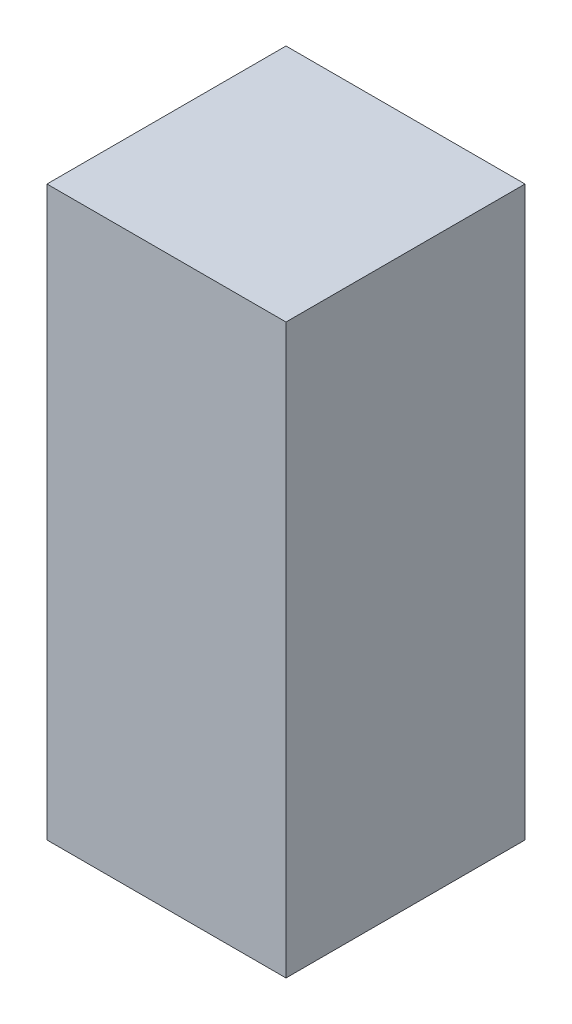
ISO-10303-21;
HEADER;
FILE_DESCRIPTION(('STEP AP214'),'2;1');
FILE_NAME('part.step','',(''),(''),'','','');
FILE_SCHEMA(('AUTOMOTIVE_DESIGN { 1 0 10303 214 1 1 1 1 }'));
ENDSEC;
DATA;
#1=APPLICATION_CONTEXT('core data for automotive mechanical design processes');
#2=APPLICATION_PROTOCOL_DEFINITION('international standard','automotive_design',2000,#1);
#3=PRODUCT_CONTEXT('',#1,'mechanical');
#4=PRODUCT('Part','Part','',(#3));
#5=PRODUCT_RELATED_PRODUCT_CATEGORY('part','',(#4));
#6=PRODUCT_DEFINITION_FORMATION('','',#4);
#7=PRODUCT_DEFINITION_CONTEXT('part definition',#1,'design');
#8=PRODUCT_DEFINITION('design','',#6,#7);
#9=PRODUCT_DEFINITION_SHAPE('','',#8);
#10=(LENGTH_UNIT() NAMED_UNIT(*) SI_UNIT(.MILLI.,.METRE.));
#11=(NAMED_UNIT(*) PLANE_ANGLE_UNIT() SI_UNIT($,.RADIAN.));
#12=(NAMED_UNIT(*) SI_UNIT($,.STERADIAN.) SOLID_ANGLE_UNIT());
#13=UNCERTAINTY_MEASURE_WITH_UNIT(LENGTH_MEASURE(1.E-05),#10,'distance_accuracy_value','');
#14=(GEOMETRIC_REPRESENTATION_CONTEXT(3) GLOBAL_UNCERTAINTY_ASSIGNED_CONTEXT((#13)) GLOBAL_UNIT_ASSIGNED_CONTEXT((#10,
#11,#12)) REPRESENTATION_CONTEXT('',''));
#15=CARTESIAN_POINT('',(0.,0.,0.));
#16=DIRECTION('',(0.,0.,1.));
#17=DIRECTION('',(1.,0.,0.));
#18=AXIS2_PLACEMENT_3D('',#15,#16,#17);
#19=CARTESIAN_POINT('',(3.,14.26,3.));
#20=DIRECTION('',(-1.,0.,0.));
#21=DIRECTION('',(0.,0.,1.));
#22=AXIS2_PLACEMENT_3D('',#19,#20,#21);
#23=PLANE('',#22);
#24=DIRECTION('',(0.,0.,-1.));
#25=VECTOR('',#24,1.);
#26=CARTESIAN_POINT('',(3.,0.,3.));
#27=LINE('',#26,#25);
#28=CARTESIAN_POINT('',(3.,0.,3.));
#29=VERTEX_POINT('',#28);
#30=CARTESIAN_POINT('',(3.,0.,-3.));
#31=VERTEX_POINT('',#30);
#32=EDGE_CURVE('E97',#29,#31,#27,.T.);
#33=ORIENTED_EDGE('',*,*,#32,.T.);
#34=DIRECTION('',(0.,-1.,0.));
#35=VECTOR('',#34,1.);
#36=CARTESIAN_POINT('',(3.,14.26,-3.));
#37=LINE('',#36,#35);
#38=CARTESIAN_POINT('',(3.,14.26,-3.));
#39=VERTEX_POINT('',#38);
#40=EDGE_CURVE('E11',#39,#31,#37,.T.);
#41=ORIENTED_EDGE('',*,*,#40,.F.);
#42=DIRECTION('',(0.,0.,-1.));
#43=VECTOR('',#42,1.);
#44=CARTESIAN_POINT('',(3.,14.26,3.));
#45=LINE('',#44,#43);
#46=CARTESIAN_POINT('',(3.,14.26,3.));
#47=VERTEX_POINT('',#46);
#48=EDGE_CURVE('E85',#47,#39,#45,.T.);
#49=ORIENTED_EDGE('',*,*,#48,.F.);
#50=DIRECTION('',(0.,-1.,0.));
#51=VECTOR('',#50,1.);
#52=CARTESIAN_POINT('',(3.,14.26,3.));
#53=LINE('',#52,#51);
#54=EDGE_CURVE('E93',#47,#29,#53,.T.);
#55=ORIENTED_EDGE('',*,*,#54,.T.);
#56=EDGE_LOOP('',(#33,#41,#49,#55));
#57=FACE_BOUND('',#56,.T.);
#58=ADVANCED_FACE('F34',(#57),#23,.F.);
#59=CARTESIAN_POINT('',(-3.,14.26,-3.));
#60=DIRECTION('',(0.,0.,1.));
#61=DIRECTION('',(1.,0.,0.));
#62=AXIS2_PLACEMENT_3D('',#59,#60,#61);
#63=PLANE('',#62);
#64=DIRECTION('',(-1.,0.,0.));
#65=VECTOR('',#64,1.);
#66=CARTESIAN_POINT('',(-3.,0.,-3.));
#67=LINE('',#66,#65);
#68=CARTESIAN_POINT('',(-3.,0.,-3.));
#69=VERTEX_POINT('',#68);
#70=EDGE_CURVE('E89',#31,#69,#67,.T.);
#71=ORIENTED_EDGE('',*,*,#70,.T.);
#72=DIRECTION('',(0.,-1.,0.));
#73=VECTOR('',#72,1.);
#74=CARTESIAN_POINT('',(-3.,14.26,-3.));
#75=LINE('',#74,#73);
#76=CARTESIAN_POINT('',(-3.,14.26,-3.));
#77=VERTEX_POINT('',#76);
#78=EDGE_CURVE('E42',#77,#69,#75,.T.);
#79=ORIENTED_EDGE('',*,*,#78,.F.);
#80=DIRECTION('',(-1.,0.,0.));
#81=VECTOR('',#80,1.);
#82=CARTESIAN_POINT('',(-3.,14.26,-3.));
#83=LINE('',#82,#81);
#84=EDGE_CURVE('E80',#39,#77,#83,.T.);
#85=ORIENTED_EDGE('',*,*,#84,.F.);
#86=ORIENTED_EDGE('',*,*,#40,.T.);
#87=EDGE_LOOP('',(#71,#79,#85,#86));
#88=FACE_BOUND('',#87,.T.);
#89=ADVANCED_FACE('F88',(#88),#63,.F.);
#90=CARTESIAN_POINT('',(-3.,14.26,3.));
#91=DIRECTION('',(1.,0.,0.));
#92=DIRECTION('',(0.,0.,-1.));
#93=AXIS2_PLACEMENT_3D('',#90,#91,#92);
#94=PLANE('',#93);
#95=DIRECTION('',(0.,0.,1.));
#96=VECTOR('',#95,1.);
#97=CARTESIAN_POINT('',(-3.,0.,3.));
#98=LINE('',#97,#96);
#99=CARTESIAN_POINT('',(-3.,0.,3.));
#100=VERTEX_POINT('',#99);
#101=EDGE_CURVE('E67',#69,#100,#98,.T.);
#102=ORIENTED_EDGE('',*,*,#101,.T.);
#103=DIRECTION('',(0.,-1.,0.));
#104=VECTOR('',#103,1.);
#105=CARTESIAN_POINT('',(-3.,14.26,3.));
#106=LINE('',#105,#104);
#107=CARTESIAN_POINT('',(-3.,14.26,3.));
#108=VERTEX_POINT('',#107);
#109=EDGE_CURVE('E90',#108,#100,#106,.T.);
#110=ORIENTED_EDGE('',*,*,#109,.F.);
#111=DIRECTION('',(0.,0.,1.));
#112=VECTOR('',#111,1.);
#113=CARTESIAN_POINT('',(-3.,14.26,3.));
#114=LINE('',#113,#112);
#115=EDGE_CURVE('E83',#77,#108,#114,.T.);
#116=ORIENTED_EDGE('',*,*,#115,.F.);
#117=ORIENTED_EDGE('',*,*,#78,.T.);
#118=EDGE_LOOP('',(#102,#110,#116,#117));
#119=FACE_BOUND('',#118,.T.);
#120=ADVANCED_FACE('F91',(#119),#94,.F.);
#121=CARTESIAN_POINT('',(-3.,14.26,3.));
#122=DIRECTION('',(0.,0.,-1.));
#123=DIRECTION('',(-1.,0.,0.));
#124=AXIS2_PLACEMENT_3D('',#121,#122,#123);
#125=PLANE('',#124);
#126=DIRECTION('',(1.,0.,0.));
#127=VECTOR('',#126,1.);
#128=CARTESIAN_POINT('',(-3.,0.,3.));
#129=LINE('',#128,#127);
#130=EDGE_CURVE('E73',#100,#29,#129,.T.);
#131=ORIENTED_EDGE('',*,*,#130,.T.);
#132=ORIENTED_EDGE('',*,*,#54,.F.);
#133=DIRECTION('',(1.,0.,0.));
#134=VECTOR('',#133,1.);
#135=CARTESIAN_POINT('',(-3.,14.26,3.));
#136=LINE('',#135,#134);
#137=EDGE_CURVE('E50',#108,#47,#136,.T.);
#138=ORIENTED_EDGE('',*,*,#137,.F.);
#139=ORIENTED_EDGE('',*,*,#109,.T.);
#140=EDGE_LOOP('',(#131,#132,#138,#139));
#141=FACE_BOUND('',#140,.T.);
#142=ADVANCED_FACE('F104',(#141),#125,.F.);
#143=CARTESIAN_POINT('',(0.,14.26,0.));
#144=DIRECTION('',(0.,-1.,0.));
#145=DIRECTION('',(0.,0.,-1.));
#146=AXIS2_PLACEMENT_3D('',#143,#144,#145);
#147=PLANE('',#146);
#148=ORIENTED_EDGE('',*,*,#48,.T.);
#149=ORIENTED_EDGE('',*,*,#84,.T.);
#150=ORIENTED_EDGE('',*,*,#115,.T.);
#151=ORIENTED_EDGE('',*,*,#137,.T.);
#152=EDGE_LOOP('',(#148,#149,#150,#151));
#153=FACE_BOUND('',#152,.T.);
#154=ADVANCED_FACE('F81',(#153),#147,.F.);
#155=CARTESIAN_POINT('',(0.,0.,0.));
#156=DIRECTION('',(0.,-1.,0.));
#157=DIRECTION('',(0.,0.,-1.));
#158=AXIS2_PLACEMENT_3D('',#155,#156,#157);
#159=PLANE('',#158);
#160=ORIENTED_EDGE('',*,*,#32,.F.);
#161=ORIENTED_EDGE('',*,*,#130,.F.);
#162=ORIENTED_EDGE('',*,*,#101,.F.);
#163=ORIENTED_EDGE('',*,*,#70,.F.);
#164=EDGE_LOOP('',(#160,#161,#162,#163));
#165=FACE_BOUND('',#164,.T.);
#166=ADVANCED_FACE('F107',(#165),#159,.T.);
#167=CLOSED_SHELL('',(#58,#89,#120,#142,#154,#166));
#168=MANIFOLD_SOLID_BREP('B2',#167);
#169=ADVANCED_BREP_SHAPE_REPRESENTATION('',(#18,#168),#14);
#170=SHAPE_DEFINITION_REPRESENTATION(#9,#169);
ENDSEC;
END-ISO-10303-21;
